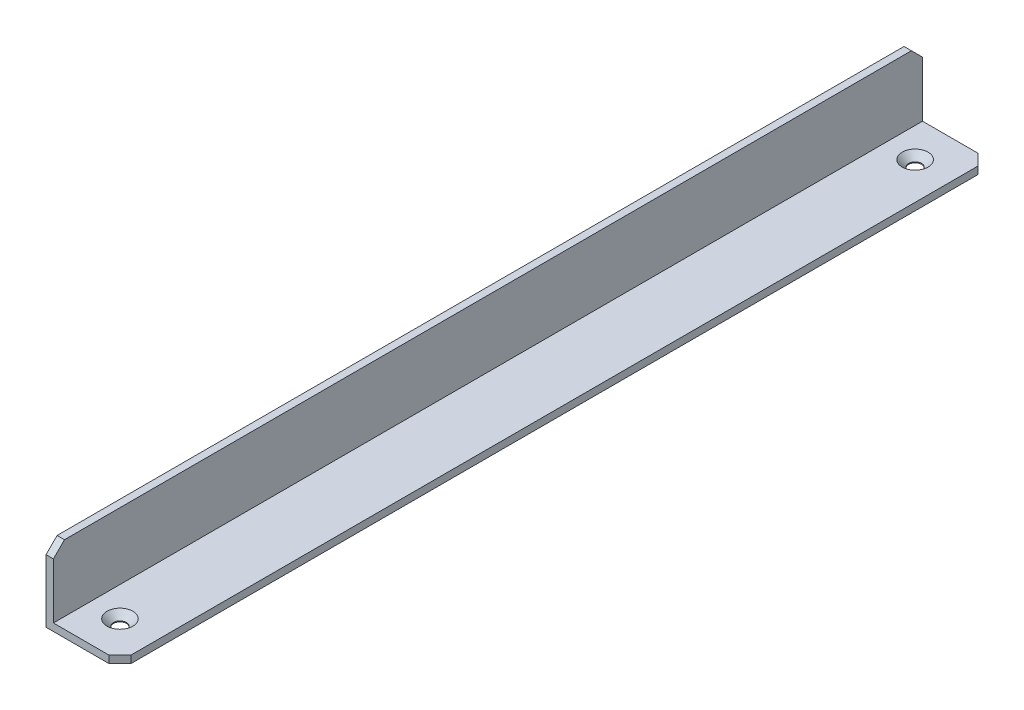
ISO-10303-21;
HEADER;
FILE_DESCRIPTION(('STEP AP214'),'2;1');
FILE_NAME('part.step','',(''),(''),'','','');
FILE_SCHEMA(('AUTOMOTIVE_DESIGN { 1 0 10303 214 1 1 1 1 }'));
ENDSEC;
DATA;
#1=APPLICATION_CONTEXT('core data for automotive mechanical design processes');
#2=APPLICATION_PROTOCOL_DEFINITION('international standard','automotive_design',2000,#1);
#3=PRODUCT_CONTEXT('',#1,'mechanical');
#4=PRODUCT('Part','Part','',(#3));
#5=PRODUCT_RELATED_PRODUCT_CATEGORY('part','',(#4));
#6=PRODUCT_DEFINITION_FORMATION('','',#4);
#7=PRODUCT_DEFINITION_CONTEXT('part definition',#1,'design');
#8=PRODUCT_DEFINITION('design','',#6,#7);
#9=PRODUCT_DEFINITION_SHAPE('','',#8);
#10=(LENGTH_UNIT() NAMED_UNIT(*) SI_UNIT(.MILLI.,.METRE.));
#11=(NAMED_UNIT(*) PLANE_ANGLE_UNIT() SI_UNIT($,.RADIAN.));
#12=(NAMED_UNIT(*) SI_UNIT($,.STERADIAN.) SOLID_ANGLE_UNIT());
#13=UNCERTAINTY_MEASURE_WITH_UNIT(LENGTH_MEASURE(1.E-05),#10,'distance_accuracy_value','');
#14=(GEOMETRIC_REPRESENTATION_CONTEXT(3) GLOBAL_UNCERTAINTY_ASSIGNED_CONTEXT((#13)) GLOBAL_UNIT_ASSIGNED_CONTEXT((#10,
#11,#12)) REPRESENTATION_CONTEXT('',''));
#15=CARTESIAN_POINT('',(0.,0.,0.));
#16=DIRECTION('',(0.,0.,1.));
#17=DIRECTION('',(1.,0.,0.));
#18=AXIS2_PLACEMENT_3D('',#15,#16,#17);
#19=CARTESIAN_POINT('',(0.,0.,117.5));
#20=DIRECTION('',(1.,0.,0.));
#21=DIRECTION('',(0.,0.,-1.));
#22=AXIS2_PLACEMENT_3D('',#19,#20,#21);
#23=PLANE('',#22);
#24=DIRECTION('',(0.,0.,-1.));
#25=VECTOR('',#24,1.);
#26=CARTESIAN_POINT('',(0.,20.,117.5));
#27=LINE('',#26,#25);
#28=CARTESIAN_POINT('',(0.,20.,114.5));
#29=VERTEX_POINT('',#28);
#30=CARTESIAN_POINT('',(0.,20.,-114.5));
#31=VERTEX_POINT('',#30);
#32=EDGE_CURVE('E193',#29,#31,#27,.T.);
#33=ORIENTED_EDGE('',*,*,#32,.T.);
#34=DIRECTION('',(0.,-0.707106781186551,-0.707106781186544));
#35=VECTOR('',#34,1.);
#36=CARTESIAN_POINT('',(0.,20.,-114.5));
#37=LINE('',#36,#35);
#38=CARTESIAN_POINT('',(0.,17.,-117.5));
#39=VERTEX_POINT('',#38);
#40=EDGE_CURVE('E175',#31,#39,#37,.T.);
#41=ORIENTED_EDGE('',*,*,#40,.T.);
#42=DIRECTION('',(0.,-1.,0.));
#43=VECTOR('',#42,1.);
#44=CARTESIAN_POINT('',(0.,0.,-117.5));
#45=LINE('',#44,#43);
#46=CARTESIAN_POINT('',(0.,0.,-117.5));
#47=VERTEX_POINT('',#46);
#48=EDGE_CURVE('E135',#39,#47,#45,.T.);
#49=ORIENTED_EDGE('',*,*,#48,.T.);
#50=DIRECTION('',(0.,0.,-1.));
#51=VECTOR('',#50,1.);
#52=CARTESIAN_POINT('',(0.,0.,117.5));
#53=LINE('',#52,#51);
#54=CARTESIAN_POINT('',(0.,0.,117.5));
#55=VERTEX_POINT('',#54);
#56=EDGE_CURVE('E127',#55,#47,#53,.T.);
#57=ORIENTED_EDGE('',*,*,#56,.F.);
#58=DIRECTION('',(0.,-1.,0.));
#59=VECTOR('',#58,1.);
#60=CARTESIAN_POINT('',(0.,0.,117.5));
#61=LINE('',#60,#59);
#62=CARTESIAN_POINT('',(0.,17.,117.5));
#63=VERTEX_POINT('',#62);
#64=EDGE_CURVE('E114',#63,#55,#61,.T.);
#65=ORIENTED_EDGE('',*,*,#64,.F.);
#66=DIRECTION('',(0.,-0.707106781186547,0.707106781186547));
#67=VECTOR('',#66,1.);
#68=CARTESIAN_POINT('',(0.,17.,117.5));
#69=LINE('',#68,#67);
#70=EDGE_CURVE('E57',#63,#29,#69,.F.);
#71=ORIENTED_EDGE('',*,*,#70,.T.);
#72=EDGE_LOOP('',(#33,#41,#49,#57,#65,#71));
#73=FACE_BOUND('',#72,.T.);
#74=ADVANCED_FACE('F34',(#73),#23,.F.);
#75=CARTESIAN_POINT('',(0.,0.,117.5));
#76=DIRECTION('',(0.,1.,0.));
#77=DIRECTION('',(0.,0.,1.));
#78=AXIS2_PLACEMENT_3D('',#75,#76,#77);
#79=PLANE('',#78);
#80=CARTESIAN_POINT('',(9.99999999999998,0.,-107.5));
#81=DIRECTION('',(0.,1.,0.));
#82=DIRECTION('',(-1.,0.,0.));
#83=AXIS2_PLACEMENT_3D('',#80,#81,#82);
#84=CIRCLE('',#83,1.75);
#85=CARTESIAN_POINT('',(8.24999999999998,0.,-107.5));
#86=VERTEX_POINT('',#85);
#87=EDGE_CURVE('E154',#86,#86,#84,.T.);
#88=ORIENTED_EDGE('',*,*,#87,.T.);
#89=EDGE_LOOP('',(#88));
#90=FACE_BOUND('',#89,.T.);
#91=CARTESIAN_POINT('',(10.,0.,107.5));
#92=DIRECTION('',(0.,1.,0.));
#93=DIRECTION('',(-1.,0.,0.));
#94=AXIS2_PLACEMENT_3D('',#91,#92,#93);
#95=CIRCLE('',#94,1.75);
#96=CARTESIAN_POINT('',(8.25000000000001,0.,107.5));
#97=VERTEX_POINT('',#96);
#98=EDGE_CURVE('E151',#97,#97,#95,.T.);
#99=ORIENTED_EDGE('',*,*,#98,.T.);
#100=EDGE_LOOP('',(#99));
#101=FACE_BOUND('',#100,.T.);
#102=DIRECTION('',(1.,0.,0.));
#103=VECTOR('',#102,1.);
#104=CARTESIAN_POINT('',(0.,0.,-117.5));
#105=LINE('',#104,#103);
#106=CARTESIAN_POINT('',(17.,0.,-117.5));
#107=VERTEX_POINT('',#106);
#108=EDGE_CURVE('E199',#47,#107,#105,.T.);
#109=ORIENTED_EDGE('',*,*,#108,.T.);
#110=DIRECTION('',(0.707106781186551,0.,0.707106781186544));
#111=VECTOR('',#110,1.);
#112=CARTESIAN_POINT('',(20.,0.,-114.5));
#113=LINE('',#112,#111);
#114=CARTESIAN_POINT('',(20.,0.,-114.5));
#115=VERTEX_POINT('',#114);
#116=EDGE_CURVE('E167',#107,#115,#113,.T.);
#117=ORIENTED_EDGE('',*,*,#116,.T.);
#118=DIRECTION('',(0.,0.,-1.));
#119=VECTOR('',#118,1.);
#120=CARTESIAN_POINT('',(20.,0.,117.5));
#121=LINE('',#120,#119);
#122=CARTESIAN_POINT('',(20.,0.,114.5));
#123=VERTEX_POINT('',#122);
#124=EDGE_CURVE('E138',#123,#115,#121,.T.);
#125=ORIENTED_EDGE('',*,*,#124,.F.);
#126=DIRECTION('',(0.707106781186547,0.,-0.707106781186547));
#127=VECTOR('',#126,1.);
#128=CARTESIAN_POINT('',(17.,0.,117.5));
#129=LINE('',#128,#127);
#130=CARTESIAN_POINT('',(17.,0.,117.5));
#131=VERTEX_POINT('',#130);
#132=EDGE_CURVE('E130',#123,#131,#129,.F.);
#133=ORIENTED_EDGE('',*,*,#132,.T.);
#134=DIRECTION('',(1.,0.,0.));
#135=VECTOR('',#134,1.);
#136=CARTESIAN_POINT('',(0.,0.,117.5));
#137=LINE('',#136,#135);
#138=EDGE_CURVE('E117',#55,#131,#137,.T.);
#139=ORIENTED_EDGE('',*,*,#138,.F.);
#140=ORIENTED_EDGE('',*,*,#56,.T.);
#141=EDGE_LOOP('',(#109,#117,#125,#133,#139,#140));
#142=FACE_BOUND('',#141,.T.);
#143=ADVANCED_FACE('F126',(#90,#101,#142),#79,.F.);
#144=CARTESIAN_POINT('',(20.,0.,117.5));
#145=DIRECTION('',(-1.,0.,0.));
#146=DIRECTION('',(0.,0.,1.));
#147=AXIS2_PLACEMENT_3D('',#144,#145,#146);
#148=PLANE('',#147);
#149=ORIENTED_EDGE('',*,*,#124,.T.);
#150=DIRECTION('',(0.,1.,0.));
#151=VECTOR('',#150,1.);
#152=CARTESIAN_POINT('',(20.,2.,-114.5));
#153=LINE('',#152,#151);
#154=CARTESIAN_POINT('',(20.,2.,-114.5));
#155=VERTEX_POINT('',#154);
#156=EDGE_CURVE('E140',#115,#155,#153,.T.);
#157=ORIENTED_EDGE('',*,*,#156,.T.);
#158=DIRECTION('',(0.,0.,-1.));
#159=VECTOR('',#158,1.);
#160=CARTESIAN_POINT('',(20.,2.,117.5));
#161=LINE('',#160,#159);
#162=CARTESIAN_POINT('',(20.,2.,114.5));
#163=VERTEX_POINT('',#162);
#164=EDGE_CURVE('E143',#163,#155,#161,.T.);
#165=ORIENTED_EDGE('',*,*,#164,.F.);
#166=DIRECTION('',(0.,-1.,0.));
#167=VECTOR('',#166,1.);
#168=CARTESIAN_POINT('',(20.,0.,114.5));
#169=LINE('',#168,#167);
#170=EDGE_CURVE('E137',#163,#123,#169,.T.);
#171=ORIENTED_EDGE('',*,*,#170,.T.);
#172=EDGE_LOOP('',(#149,#157,#165,#171));
#173=FACE_BOUND('',#172,.T.);
#174=ADVANCED_FACE('F220',(#173),#148,.F.);
#175=CARTESIAN_POINT('',(20.,2.,117.5));
#176=DIRECTION('',(0.,-1.,0.));
#177=DIRECTION('',(1.,0.,0.));
#178=AXIS2_PLACEMENT_3D('',#175,#176,#177);
#179=PLANE('',#178);
#180=CARTESIAN_POINT('',(10.,2.,107.5));
#181=DIRECTION('',(0.,1.,0.));
#182=DIRECTION('',(-1.,0.,0.));
#183=AXIS2_PLACEMENT_3D('',#180,#181,#182);
#184=CIRCLE('',#183,3.50000000000001);
#185=CARTESIAN_POINT('',(6.5,2.,107.5));
#186=VERTEX_POINT('',#185);
#187=EDGE_CURVE('E150',#186,#186,#184,.T.);
#188=ORIENTED_EDGE('',*,*,#187,.F.);
#189=EDGE_LOOP('',(#188));
#190=FACE_BOUND('',#189,.T.);
#191=CARTESIAN_POINT('',(9.99999999999998,2.,-107.5));
#192=DIRECTION('',(0.,1.,0.));
#193=DIRECTION('',(-1.,0.,0.));
#194=AXIS2_PLACEMENT_3D('',#191,#192,#193);
#195=CIRCLE('',#194,3.50000000000001);
#196=CARTESIAN_POINT('',(6.49999999999997,2.,-107.5));
#197=VERTEX_POINT('',#196);
#198=EDGE_CURVE('E200',#197,#197,#195,.T.);
#199=ORIENTED_EDGE('',*,*,#198,.F.);
#200=EDGE_LOOP('',(#199));
#201=FACE_BOUND('',#200,.T.);
#202=ORIENTED_EDGE('',*,*,#164,.T.);
#203=DIRECTION('',(-0.707106781186551,0.,-0.707106781186544));
#204=VECTOR('',#203,1.);
#205=CARTESIAN_POINT('',(20.,2.,-114.5));
#206=LINE('',#205,#204);
#207=CARTESIAN_POINT('',(17.,2.,-117.5));
#208=VERTEX_POINT('',#207);
#209=EDGE_CURVE('E160',#155,#208,#206,.T.);
#210=ORIENTED_EDGE('',*,*,#209,.T.);
#211=DIRECTION('',(-1.,0.,0.));
#212=VECTOR('',#211,1.);
#213=CARTESIAN_POINT('',(20.,2.,-117.5));
#214=LINE('',#213,#212);
#215=CARTESIAN_POINT('',(2.00000000000001,2.,-117.5));
#216=VERTEX_POINT('',#215);
#217=EDGE_CURVE('E202',#208,#216,#214,.T.);
#218=ORIENTED_EDGE('',*,*,#217,.T.);
#219=DIRECTION('',(0.,0.,-1.));
#220=VECTOR('',#219,1.);
#221=CARTESIAN_POINT('',(2.00000000000001,2.,117.5));
#222=LINE('',#221,#220);
#223=CARTESIAN_POINT('',(2.00000000000001,2.,117.5));
#224=VERTEX_POINT('',#223);
#225=EDGE_CURVE('E192',#224,#216,#222,.T.);
#226=ORIENTED_EDGE('',*,*,#225,.F.);
#227=DIRECTION('',(-1.,0.,0.));
#228=VECTOR('',#227,1.);
#229=CARTESIAN_POINT('',(20.,2.,117.5));
#230=LINE('',#229,#228);
#231=CARTESIAN_POINT('',(17.,2.,117.5));
#232=VERTEX_POINT('',#231);
#233=EDGE_CURVE('E131',#232,#224,#230,.T.);
#234=ORIENTED_EDGE('',*,*,#233,.F.);
#235=DIRECTION('',(-0.707106781186547,0.,0.707106781186547));
#236=VECTOR('',#235,1.);
#237=CARTESIAN_POINT('',(17.,2.,117.5));
#238=LINE('',#237,#236);
#239=EDGE_CURVE('E158',#232,#163,#238,.F.);
#240=ORIENTED_EDGE('',*,*,#239,.T.);
#241=EDGE_LOOP('',(#202,#210,#218,#226,#234,#240));
#242=FACE_BOUND('',#241,.T.);
#243=ADVANCED_FACE('F216',(#190,#201,#242),#179,.F.);
#244=CARTESIAN_POINT('',(2.,20.,117.5));
#245=DIRECTION('',(-1.,0.,0.));
#246=DIRECTION('',(0.,-1.,0.));
#247=AXIS2_PLACEMENT_3D('',#244,#245,#246);
#248=PLANE('',#247);
#249=DIRECTION('',(0.,1.,0.));
#250=VECTOR('',#249,1.);
#251=CARTESIAN_POINT('',(2.,20.,-117.5));
#252=LINE('',#251,#250);
#253=CARTESIAN_POINT('',(2.,17.,-117.5));
#254=VERTEX_POINT('',#253);
#255=EDGE_CURVE('E121',#216,#254,#252,.T.);
#256=ORIENTED_EDGE('',*,*,#255,.T.);
#257=DIRECTION('',(0.,0.707106781186551,0.707106781186544));
#258=VECTOR('',#257,1.);
#259=CARTESIAN_POINT('',(2.,20.,-114.5));
#260=LINE('',#259,#258);
#261=CARTESIAN_POINT('',(2.,20.,-114.5));
#262=VERTEX_POINT('',#261);
#263=EDGE_CURVE('E178',#254,#262,#260,.T.);
#264=ORIENTED_EDGE('',*,*,#263,.T.);
#265=DIRECTION('',(0.,0.,-1.));
#266=VECTOR('',#265,1.);
#267=CARTESIAN_POINT('',(2.,20.,117.5));
#268=LINE('',#267,#266);
#269=CARTESIAN_POINT('',(2.,20.,114.5));
#270=VERTEX_POINT('',#269);
#271=EDGE_CURVE('E183',#270,#262,#268,.T.);
#272=ORIENTED_EDGE('',*,*,#271,.F.);
#273=DIRECTION('',(0.,0.707106781186547,-0.707106781186547));
#274=VECTOR('',#273,1.);
#275=CARTESIAN_POINT('',(2.,17.,117.5));
#276=LINE('',#275,#274);
#277=CARTESIAN_POINT('',(2.,17.,117.5));
#278=VERTEX_POINT('',#277);
#279=EDGE_CURVE('E49',#270,#278,#276,.F.);
#280=ORIENTED_EDGE('',*,*,#279,.T.);
#281=DIRECTION('',(0.,1.,0.));
#282=VECTOR('',#281,1.);
#283=CARTESIAN_POINT('',(2.,20.,117.5));
#284=LINE('',#283,#282);
#285=EDGE_CURVE('E207',#224,#278,#284,.T.);
#286=ORIENTED_EDGE('',*,*,#285,.F.);
#287=ORIENTED_EDGE('',*,*,#225,.T.);
#288=EDGE_LOOP('',(#256,#264,#272,#280,#286,#287));
#289=FACE_BOUND('',#288,.T.);
#290=ADVANCED_FACE('F182',(#289),#248,.F.);
#291=CARTESIAN_POINT('',(0.,20.,117.5));
#292=DIRECTION('',(0.,-1.,0.));
#293=DIRECTION('',(0.,0.,-1.));
#294=AXIS2_PLACEMENT_3D('',#291,#292,#293);
#295=PLANE('',#294);
#296=ORIENTED_EDGE('',*,*,#271,.T.);
#297=DIRECTION('',(-1.,0.,0.));
#298=VECTOR('',#297,1.);
#299=CARTESIAN_POINT('',(0.,20.,-114.5));
#300=LINE('',#299,#298);
#301=EDGE_CURVE('E171',#262,#31,#300,.T.);
#302=ORIENTED_EDGE('',*,*,#301,.T.);
#303=ORIENTED_EDGE('',*,*,#32,.F.);
#304=DIRECTION('',(1.,0.,0.));
#305=VECTOR('',#304,1.);
#306=CARTESIAN_POINT('',(0.,20.,114.5));
#307=LINE('',#306,#305);
#308=EDGE_CURVE('E169',#29,#270,#307,.T.);
#309=ORIENTED_EDGE('',*,*,#308,.T.);
#310=EDGE_LOOP('',(#296,#302,#303,#309));
#311=FACE_BOUND('',#310,.T.);
#312=ADVANCED_FACE('F190',(#311),#295,.F.);
#313=CARTESIAN_POINT('',(0.,0.,117.5));
#314=DIRECTION('',(0.,0.,-1.));
#315=DIRECTION('',(-1.,0.,0.));
#316=AXIS2_PLACEMENT_3D('',#313,#314,#315);
#317=PLANE('',#316);
#318=ORIENTED_EDGE('',*,*,#138,.T.);
#319=DIRECTION('',(0.,1.,0.));
#320=VECTOR('',#319,1.);
#321=CARTESIAN_POINT('',(17.,0.,117.5));
#322=LINE('',#321,#320);
#323=EDGE_CURVE('E11',#131,#232,#322,.T.);
#324=ORIENTED_EDGE('',*,*,#323,.T.);
#325=ORIENTED_EDGE('',*,*,#233,.T.);
#326=ORIENTED_EDGE('',*,*,#285,.T.);
#327=DIRECTION('',(-1.,0.,0.));
#328=VECTOR('',#327,1.);
#329=CARTESIAN_POINT('',(0.,17.,117.5));
#330=LINE('',#329,#328);
#331=EDGE_CURVE('E42',#278,#63,#330,.T.);
#332=ORIENTED_EDGE('',*,*,#331,.T.);
#333=ORIENTED_EDGE('',*,*,#64,.T.);
#334=EDGE_LOOP('',(#318,#324,#325,#326,#332,#333));
#335=FACE_BOUND('',#334,.T.);
#336=ADVANCED_FACE('F116',(#335),#317,.F.);
#337=CARTESIAN_POINT('',(0.,0.,-117.5));
#338=DIRECTION('',(0.,0.,-1.));
#339=DIRECTION('',(-1.,0.,0.));
#340=AXIS2_PLACEMENT_3D('',#337,#338,#339);
#341=PLANE('',#340);
#342=ORIENTED_EDGE('',*,*,#217,.F.);
#343=DIRECTION('',(0.,-1.,0.));
#344=VECTOR('',#343,1.);
#345=CARTESIAN_POINT('',(17.,0.,-117.5));
#346=LINE('',#345,#344);
#347=EDGE_CURVE('E164',#208,#107,#346,.T.);
#348=ORIENTED_EDGE('',*,*,#347,.T.);
#349=ORIENTED_EDGE('',*,*,#108,.F.);
#350=ORIENTED_EDGE('',*,*,#48,.F.);
#351=DIRECTION('',(1.,0.,0.));
#352=VECTOR('',#351,1.);
#353=CARTESIAN_POINT('',(2.,17.,-117.5));
#354=LINE('',#353,#352);
#355=EDGE_CURVE('E162',#39,#254,#354,.T.);
#356=ORIENTED_EDGE('',*,*,#355,.T.);
#357=ORIENTED_EDGE('',*,*,#255,.F.);
#358=EDGE_LOOP('',(#342,#348,#349,#350,#356,#357));
#359=FACE_BOUND('',#358,.T.);
#360=ADVANCED_FACE('F198',(#359),#341,.T.);
#361=CARTESIAN_POINT('',(9.99999999999998,2.,-107.5));
#362=DIRECTION('',(0.,1.,0.));
#363=DIRECTION('',(-1.,0.,0.));
#364=AXIS2_PLACEMENT_3D('',#361,#362,#363);
#365=CONICAL_SURFACE('',#364,3.50000000000001,0.78539816339745);
#366=CARTESIAN_POINT('',(9.99999999999998,0.249999999999995,-107.5));
#367=DIRECTION('',(0.,1.,0.));
#368=DIRECTION('',(-1.,0.,0.));
#369=AXIS2_PLACEMENT_3D('',#366,#367,#368);
#370=CIRCLE('',#369,1.75);
#371=CARTESIAN_POINT('',(8.24999999999998,0.249999999999995,-107.5));
#372=VERTEX_POINT('',#371);
#373=EDGE_CURVE('E152',#372,#372,#370,.F.);
#374=ORIENTED_EDGE('',*,*,#373,.T.);
#375=EDGE_LOOP('',(#374));
#376=FACE_BOUND('',#375,.T.);
#377=ORIENTED_EDGE('',*,*,#198,.T.);
#378=EDGE_LOOP('',(#377));
#379=FACE_BOUND('',#378,.T.);
#380=ADVANCED_FACE('F243',(#376,#379),#365,.F.);
#381=CARTESIAN_POINT('',(10.,2.,107.5));
#382=DIRECTION('',(0.,1.,0.));
#383=DIRECTION('',(-1.,0.,0.));
#384=AXIS2_PLACEMENT_3D('',#381,#382,#383);
#385=CONICAL_SURFACE('',#384,3.50000000000001,0.78539816339745);
#386=CARTESIAN_POINT('',(10.,0.249999999999996,107.5));
#387=DIRECTION('',(0.,1.,0.));
#388=DIRECTION('',(-1.,0.,0.));
#389=AXIS2_PLACEMENT_3D('',#386,#387,#388);
#390=CIRCLE('',#389,1.75);
#391=CARTESIAN_POINT('',(8.25000000000001,0.249999999999996,107.5));
#392=VERTEX_POINT('',#391);
#393=EDGE_CURVE('E147',#392,#392,#390,.F.);
#394=ORIENTED_EDGE('',*,*,#393,.T.);
#395=EDGE_LOOP('',(#394));
#396=FACE_BOUND('',#395,.T.);
#397=ORIENTED_EDGE('',*,*,#187,.T.);
#398=EDGE_LOOP('',(#397));
#399=FACE_BOUND('',#398,.T.);
#400=ADVANCED_FACE('F246',(#396,#399),#385,.F.);
#401=CARTESIAN_POINT('',(10.,0.,107.5));
#402=DIRECTION('',(0.,1.,0.));
#403=DIRECTION('',(-1.,0.,0.));
#404=AXIS2_PLACEMENT_3D('',#401,#402,#403);
#405=CYLINDRICAL_SURFACE('',#404,1.75);
#406=ORIENTED_EDGE('',*,*,#98,.F.);
#407=EDGE_LOOP('',(#406));
#408=FACE_BOUND('',#407,.T.);
#409=ORIENTED_EDGE('',*,*,#393,.F.);
#410=EDGE_LOOP('',(#409));
#411=FACE_BOUND('',#410,.T.);
#412=ADVANCED_FACE('F239',(#408,#411),#405,.F.);
#413=CARTESIAN_POINT('',(9.99999999999998,0.,-107.5));
#414=DIRECTION('',(0.,1.,0.));
#415=DIRECTION('',(-1.,0.,0.));
#416=AXIS2_PLACEMENT_3D('',#413,#414,#415);
#417=CYLINDRICAL_SURFACE('',#416,1.75);
#418=ORIENTED_EDGE('',*,*,#87,.F.);
#419=EDGE_LOOP('',(#418));
#420=FACE_BOUND('',#419,.T.);
#421=ORIENTED_EDGE('',*,*,#373,.F.);
#422=EDGE_LOOP('',(#421));
#423=FACE_BOUND('',#422,.T.);
#424=ADVANCED_FACE('F235',(#420,#423),#417,.F.);
#425=CARTESIAN_POINT('',(20.,0.,-114.5));
#426=DIRECTION('',(0.707106781186544,0.,-0.707106781186551));
#427=DIRECTION('',(0.,-1.,0.));
#428=AXIS2_PLACEMENT_3D('',#425,#426,#427);
#429=PLANE('',#428);
#430=ORIENTED_EDGE('',*,*,#116,.F.);
#431=ORIENTED_EDGE('',*,*,#347,.F.);
#432=ORIENTED_EDGE('',*,*,#209,.F.);
#433=ORIENTED_EDGE('',*,*,#156,.F.);
#434=EDGE_LOOP('',(#430,#431,#432,#433));
#435=FACE_BOUND('',#434,.T.);
#436=ADVANCED_FACE('F238',(#435),#429,.T.);
#437=CARTESIAN_POINT('',(0.,20.,-114.5));
#438=DIRECTION('',(0.,0.707106781186544,-0.707106781186551));
#439=DIRECTION('',(1.,0.,0.));
#440=AXIS2_PLACEMENT_3D('',#437,#438,#439);
#441=PLANE('',#440);
#442=ORIENTED_EDGE('',*,*,#263,.F.);
#443=ORIENTED_EDGE('',*,*,#355,.F.);
#444=ORIENTED_EDGE('',*,*,#40,.F.);
#445=ORIENTED_EDGE('',*,*,#301,.F.);
#446=EDGE_LOOP('',(#442,#443,#444,#445));
#447=FACE_BOUND('',#446,.T.);
#448=ADVANCED_FACE('F195',(#447),#441,.T.);
#449=CARTESIAN_POINT('',(17.,0.,117.5));
#450=DIRECTION('',(-0.707106781186547,0.,-0.707106781186547));
#451=DIRECTION('',(0.,1.,0.));
#452=AXIS2_PLACEMENT_3D('',#449,#450,#451);
#453=PLANE('',#452);
#454=ORIENTED_EDGE('',*,*,#132,.F.);
#455=ORIENTED_EDGE('',*,*,#170,.F.);
#456=ORIENTED_EDGE('',*,*,#239,.F.);
#457=ORIENTED_EDGE('',*,*,#323,.F.);
#458=EDGE_LOOP('',(#454,#455,#456,#457));
#459=FACE_BOUND('',#458,.T.);
#460=ADVANCED_FACE('F223',(#459),#453,.F.);
#461=CARTESIAN_POINT('',(0.,17.,117.5));
#462=DIRECTION('',(0.,-0.707106781186547,-0.707106781186547));
#463=DIRECTION('',(-1.,0.,0.));
#464=AXIS2_PLACEMENT_3D('',#461,#462,#463);
#465=PLANE('',#464);
#466=ORIENTED_EDGE('',*,*,#279,.F.);
#467=ORIENTED_EDGE('',*,*,#308,.F.);
#468=ORIENTED_EDGE('',*,*,#70,.F.);
#469=ORIENTED_EDGE('',*,*,#331,.F.);
#470=EDGE_LOOP('',(#466,#467,#468,#469));
#471=FACE_BOUND('',#470,.T.);
#472=ADVANCED_FACE('F36',(#471),#465,.F.);
#473=CLOSED_SHELL('',(#74,#143,#174,#243,#290,#312,#336,#360,#380,#400,#412,#424,#436,#448,#460,#472));
#474=MANIFOLD_SOLID_BREP('B2',#473);
#475=ADVANCED_BREP_SHAPE_REPRESENTATION('',(#18,#474),#14);
#476=SHAPE_DEFINITION_REPRESENTATION(#9,#475);
ENDSEC;
END-ISO-10303-21;
